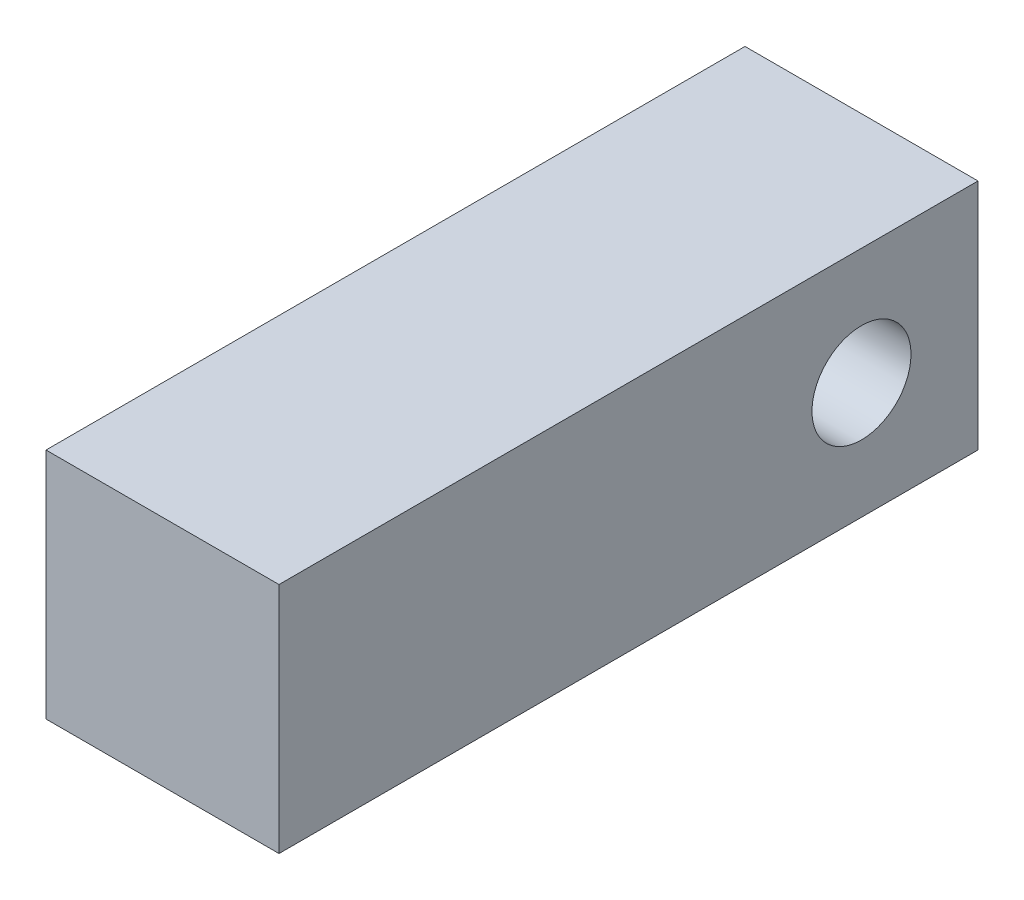
ISO-10303-21;
HEADER;
FILE_DESCRIPTION(('STEP AP214'),'2;1');
FILE_NAME('part.step','',(''),(''),'','','');
FILE_SCHEMA(('AUTOMOTIVE_DESIGN { 1 0 10303 214 1 1 1 1 }'));
ENDSEC;
DATA;
#1=APPLICATION_CONTEXT('core data for automotive mechanical design processes');
#2=APPLICATION_PROTOCOL_DEFINITION('international standard','automotive_design',2000,#1);
#3=PRODUCT_CONTEXT('',#1,'mechanical');
#4=PRODUCT('Part','Part','',(#3));
#5=PRODUCT_RELATED_PRODUCT_CATEGORY('part','',(#4));
#6=PRODUCT_DEFINITION_FORMATION('','',#4);
#7=PRODUCT_DEFINITION_CONTEXT('part definition',#1,'design');
#8=PRODUCT_DEFINITION('design','',#6,#7);
#9=PRODUCT_DEFINITION_SHAPE('','',#8);
#10=(LENGTH_UNIT() NAMED_UNIT(*) SI_UNIT(.MILLI.,.METRE.));
#11=(NAMED_UNIT(*) PLANE_ANGLE_UNIT() SI_UNIT($,.RADIAN.));
#12=(NAMED_UNIT(*) SI_UNIT($,.STERADIAN.) SOLID_ANGLE_UNIT());
#13=UNCERTAINTY_MEASURE_WITH_UNIT(LENGTH_MEASURE(1.E-05),#10,'distance_accuracy_value','');
#14=(GEOMETRIC_REPRESENTATION_CONTEXT(3) GLOBAL_UNCERTAINTY_ASSIGNED_CONTEXT((#13)) GLOBAL_UNIT_ASSIGNED_CONTEXT((#10,
#11,#12)) REPRESENTATION_CONTEXT('',''));
#15=CARTESIAN_POINT('',(0.,0.,0.));
#16=DIRECTION('',(0.,0.,1.));
#17=DIRECTION('',(1.,0.,0.));
#18=AXIS2_PLACEMENT_3D('',#15,#16,#17);
#19=CARTESIAN_POINT('',(50.8,0.,0.));
#20=DIRECTION('',(0.,0.,-1.));
#21=DIRECTION('',(-1.,0.,0.));
#22=AXIS2_PLACEMENT_3D('',#19,#20,#21);
#23=PLANE('',#22);
#24=DIRECTION('',(0.,-1.,0.));
#25=VECTOR('',#24,1.);
#26=CARTESIAN_POINT('',(0.,0.,0.));
#27=LINE('',#26,#25);
#28=CARTESIAN_POINT('',(0.,50.8,0.));
#29=VERTEX_POINT('',#28);
#30=CARTESIAN_POINT('',(0.,0.,0.));
#31=VERTEX_POINT('',#30);
#32=EDGE_CURVE('E107',#29,#31,#27,.T.);
#33=ORIENTED_EDGE('',*,*,#32,.T.);
#34=DIRECTION('',(-1.,0.,0.));
#35=VECTOR('',#34,1.);
#36=CARTESIAN_POINT('',(50.8,0.,0.));
#37=LINE('',#36,#35);
#38=CARTESIAN_POINT('',(50.8,0.,0.));
#39=VERTEX_POINT('',#38);
#40=EDGE_CURVE('E11',#39,#31,#37,.T.);
#41=ORIENTED_EDGE('',*,*,#40,.F.);
#42=DIRECTION('',(0.,-1.,0.));
#43=VECTOR('',#42,1.);
#44=CARTESIAN_POINT('',(50.8,0.,0.));
#45=LINE('',#44,#43);
#46=CARTESIAN_POINT('',(50.8,50.8,0.));
#47=VERTEX_POINT('',#46);
#48=EDGE_CURVE('E91',#47,#39,#45,.T.);
#49=ORIENTED_EDGE('',*,*,#48,.F.);
#50=DIRECTION('',(-1.,0.,0.));
#51=VECTOR('',#50,1.);
#52=CARTESIAN_POINT('',(50.8,50.8,0.));
#53=LINE('',#52,#51);
#54=EDGE_CURVE('E103',#47,#29,#53,.T.);
#55=ORIENTED_EDGE('',*,*,#54,.T.);
#56=EDGE_LOOP('',(#33,#41,#49,#55));
#57=FACE_BOUND('',#56,.T.);
#58=ADVANCED_FACE('F39',(#57),#23,.F.);
#59=CARTESIAN_POINT('',(50.8,0.,0.));
#60=DIRECTION('',(0.,1.,0.));
#61=DIRECTION('',(0.,0.,1.));
#62=AXIS2_PLACEMENT_3D('',#59,#60,#61);
#63=PLANE('',#62);
#64=DIRECTION('',(0.,0.,-1.));
#65=VECTOR('',#64,1.);
#66=CARTESIAN_POINT('',(0.,0.,0.));
#67=LINE('',#66,#65);
#68=CARTESIAN_POINT('',(0.,0.,-152.4));
#69=VERTEX_POINT('',#68);
#70=EDGE_CURVE('E96',#31,#69,#67,.T.);
#71=ORIENTED_EDGE('',*,*,#70,.T.);
#72=DIRECTION('',(-1.,0.,0.));
#73=VECTOR('',#72,1.);
#74=CARTESIAN_POINT('',(50.8,0.,-152.4));
#75=LINE('',#74,#73);
#76=CARTESIAN_POINT('',(50.8,0.,-152.4));
#77=VERTEX_POINT('',#76);
#78=EDGE_CURVE('E48',#77,#69,#75,.T.);
#79=ORIENTED_EDGE('',*,*,#78,.F.);
#80=DIRECTION('',(0.,0.,-1.));
#81=VECTOR('',#80,1.);
#82=CARTESIAN_POINT('',(50.8,0.,0.));
#83=LINE('',#82,#81);
#84=EDGE_CURVE('E86',#39,#77,#83,.T.);
#85=ORIENTED_EDGE('',*,*,#84,.F.);
#86=ORIENTED_EDGE('',*,*,#40,.T.);
#87=EDGE_LOOP('',(#71,#79,#85,#86));
#88=FACE_BOUND('',#87,.T.);
#89=ADVANCED_FACE('F95',(#88),#63,.F.);
#90=CARTESIAN_POINT('',(50.8,0.,-152.4));
#91=DIRECTION('',(0.,0.,1.));
#92=DIRECTION('',(1.,0.,0.));
#93=AXIS2_PLACEMENT_3D('',#90,#91,#92);
#94=PLANE('',#93);
#95=DIRECTION('',(0.,1.,0.));
#96=VECTOR('',#95,1.);
#97=CARTESIAN_POINT('',(0.,0.,-152.4));
#98=LINE('',#97,#96);
#99=CARTESIAN_POINT('',(0.,50.8,-152.4));
#100=VERTEX_POINT('',#99);
#101=EDGE_CURVE('E73',#69,#100,#98,.T.);
#102=ORIENTED_EDGE('',*,*,#101,.T.);
#103=DIRECTION('',(-1.,0.,0.));
#104=VECTOR('',#103,1.);
#105=CARTESIAN_POINT('',(50.8,50.8,-152.4));
#106=LINE('',#105,#104);
#107=CARTESIAN_POINT('',(50.8,50.8,-152.4));
#108=VERTEX_POINT('',#107);
#109=EDGE_CURVE('E98',#108,#100,#106,.T.);
#110=ORIENTED_EDGE('',*,*,#109,.F.);
#111=DIRECTION('',(0.,1.,0.));
#112=VECTOR('',#111,1.);
#113=CARTESIAN_POINT('',(50.8,0.,-152.4));
#114=LINE('',#113,#112);
#115=EDGE_CURVE('E89',#77,#108,#114,.T.);
#116=ORIENTED_EDGE('',*,*,#115,.F.);
#117=ORIENTED_EDGE('',*,*,#78,.T.);
#118=EDGE_LOOP('',(#102,#110,#116,#117));
#119=FACE_BOUND('',#118,.T.);
#120=ADVANCED_FACE('F99',(#119),#94,.F.);
#121=CARTESIAN_POINT('',(50.8,50.8,0.));
#122=DIRECTION('',(0.,-1.,0.));
#123=DIRECTION('',(0.,0.,-1.));
#124=AXIS2_PLACEMENT_3D('',#121,#122,#123);
#125=PLANE('',#124);
#126=DIRECTION('',(0.,0.,1.));
#127=VECTOR('',#126,1.);
#128=CARTESIAN_POINT('',(0.,50.8,0.));
#129=LINE('',#128,#127);
#130=EDGE_CURVE('E79',#100,#29,#129,.T.);
#131=ORIENTED_EDGE('',*,*,#130,.T.);
#132=ORIENTED_EDGE('',*,*,#54,.F.);
#133=DIRECTION('',(0.,0.,1.));
#134=VECTOR('',#133,1.);
#135=CARTESIAN_POINT('',(50.8,50.8,0.));
#136=LINE('',#135,#134);
#137=EDGE_CURVE('E56',#108,#47,#136,.T.);
#138=ORIENTED_EDGE('',*,*,#137,.F.);
#139=ORIENTED_EDGE('',*,*,#109,.T.);
#140=EDGE_LOOP('',(#131,#132,#138,#139));
#141=FACE_BOUND('',#140,.T.);
#142=ADVANCED_FACE('F121',(#141),#125,.F.);
#143=CARTESIAN_POINT('',(50.8,0.,0.));
#144=DIRECTION('',(-1.,0.,0.));
#145=DIRECTION('',(0.,0.,1.));
#146=AXIS2_PLACEMENT_3D('',#143,#144,#145);
#147=PLANE('',#146);
#148=CARTESIAN_POINT('',(50.8,25.4,-127.));
#149=DIRECTION('',(1.,0.,0.));
#150=DIRECTION('',(0.,0.,-1.));
#151=AXIS2_PLACEMENT_3D('',#148,#149,#150);
#152=CIRCLE('',#151,10.795);
#153=CARTESIAN_POINT('',(50.8,25.4,-137.795));
#154=VERTEX_POINT('',#153);
#155=EDGE_CURVE('E128',#154,#154,#152,.T.);
#156=ORIENTED_EDGE('',*,*,#155,.F.);
#157=EDGE_LOOP('',(#156));
#158=FACE_BOUND('',#157,.T.);
#159=ORIENTED_EDGE('',*,*,#48,.T.);
#160=ORIENTED_EDGE('',*,*,#84,.T.);
#161=ORIENTED_EDGE('',*,*,#115,.T.);
#162=ORIENTED_EDGE('',*,*,#137,.T.);
#163=EDGE_LOOP('',(#159,#160,#161,#162));
#164=FACE_BOUND('',#163,.T.);
#165=ADVANCED_FACE('F87',(#158,#164),#147,.F.);
#166=CARTESIAN_POINT('',(0.,0.,0.));
#167=DIRECTION('',(-1.,0.,0.));
#168=DIRECTION('',(0.,0.,1.));
#169=AXIS2_PLACEMENT_3D('',#166,#167,#168);
#170=PLANE('',#169);
#171=CARTESIAN_POINT('',(0.,25.4,-127.));
#172=DIRECTION('',(1.,0.,0.));
#173=DIRECTION('',(0.,0.,-1.));
#174=AXIS2_PLACEMENT_3D('',#171,#172,#173);
#175=CIRCLE('',#174,10.795);
#176=CARTESIAN_POINT('',(0.,25.4,-137.795));
#177=VERTEX_POINT('',#176);
#178=EDGE_CURVE('E111',#177,#177,#175,.T.);
#179=ORIENTED_EDGE('',*,*,#178,.T.);
#180=EDGE_LOOP('',(#179));
#181=FACE_BOUND('',#180,.T.);
#182=ORIENTED_EDGE('',*,*,#32,.F.);
#183=ORIENTED_EDGE('',*,*,#130,.F.);
#184=ORIENTED_EDGE('',*,*,#101,.F.);
#185=ORIENTED_EDGE('',*,*,#70,.F.);
#186=EDGE_LOOP('',(#182,#183,#184,#185));
#187=FACE_BOUND('',#186,.T.);
#188=ADVANCED_FACE('F124',(#181,#187),#170,.T.);
#189=CARTESIAN_POINT('',(0.,25.4,-127.));
#190=DIRECTION('',(1.,0.,0.));
#191=DIRECTION('',(0.,0.,-1.));
#192=AXIS2_PLACEMENT_3D('',#189,#190,#191);
#193=CYLINDRICAL_SURFACE('',#192,10.795);
#194=ORIENTED_EDGE('',*,*,#178,.F.);
#195=EDGE_LOOP('',(#194));
#196=FACE_BOUND('',#195,.T.);
#197=ORIENTED_EDGE('',*,*,#155,.T.);
#198=EDGE_LOOP('',(#197));
#199=FACE_BOUND('',#198,.T.);
#200=ADVANCED_FACE('F137',(#196,#199),#193,.F.);
#201=CLOSED_SHELL('',(#58,#89,#120,#142,#165,#188,#200));
#202=MANIFOLD_SOLID_BREP('B2',#201);
#203=ADVANCED_BREP_SHAPE_REPRESENTATION('',(#18,#202),#14);
#204=SHAPE_DEFINITION_REPRESENTATION(#9,#203);
ENDSEC;
END-ISO-10303-21;
